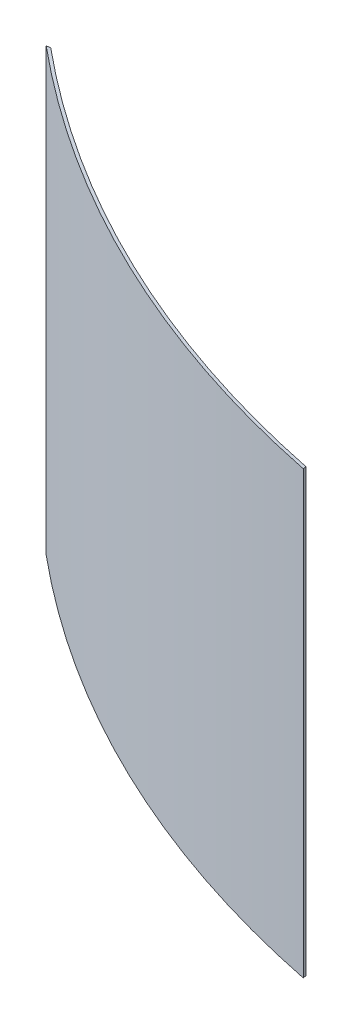
ISO-10303-21;
HEADER;
FILE_DESCRIPTION(('STEP AP214'),'2;1');
FILE_NAME('part.step','',(''),(''),'','','');
FILE_SCHEMA(('AUTOMOTIVE_DESIGN { 1 0 10303 214 1 1 1 1 }'));
ENDSEC;
DATA;
#1=APPLICATION_CONTEXT('core data for automotive mechanical design processes');
#2=APPLICATION_PROTOCOL_DEFINITION('international standard','automotive_design',2000,#1);
#3=PRODUCT_CONTEXT('',#1,'mechanical');
#4=PRODUCT('Part','Part','',(#3));
#5=PRODUCT_RELATED_PRODUCT_CATEGORY('part','',(#4));
#6=PRODUCT_DEFINITION_FORMATION('','',#4);
#7=PRODUCT_DEFINITION_CONTEXT('part definition',#1,'design');
#8=PRODUCT_DEFINITION('design','',#6,#7);
#9=PRODUCT_DEFINITION_SHAPE('','',#8);
#10=(LENGTH_UNIT() NAMED_UNIT(*) SI_UNIT(.MILLI.,.METRE.));
#11=(NAMED_UNIT(*) PLANE_ANGLE_UNIT() SI_UNIT($,.RADIAN.));
#12=(NAMED_UNIT(*) SI_UNIT($,.STERADIAN.) SOLID_ANGLE_UNIT());
#13=UNCERTAINTY_MEASURE_WITH_UNIT(LENGTH_MEASURE(1.E-05),#10,'distance_accuracy_value','');
#14=(GEOMETRIC_REPRESENTATION_CONTEXT(3) GLOBAL_UNCERTAINTY_ASSIGNED_CONTEXT((#13)) GLOBAL_UNIT_ASSIGNED_CONTEXT((#10,
#11,#12)) REPRESENTATION_CONTEXT('',''));
#15=CARTESIAN_POINT('',(0.,0.,0.));
#16=DIRECTION('',(0.,0.,1.));
#17=DIRECTION('',(1.,0.,0.));
#18=AXIS2_PLACEMENT_3D('',#15,#16,#17);
#19=CARTESIAN_POINT('',(0.,20.,0.));
#20=DIRECTION('',(0.,1.,0.));
#21=DIRECTION('',(0.,0.,1.));
#22=AXIS2_PLACEMENT_3D('',#19,#20,#21);
#23=PLANE('',#22);
#24=CARTESIAN_POINT('',(0.,20.,0.));
#25=DIRECTION('',(0.,1.,0.));
#26=DIRECTION('',(0.,0.,1.));
#27=AXIS2_PLACEMENT_3D('',#24,#25,#26);
#28=CIRCLE('',#27,51.0297553316353);
#29=CARTESIAN_POINT('',(-32.6396537617567,20.,39.2261256246293));
#30=VERTEX_POINT('',#29);
#31=CARTESIAN_POINT('',(-10.2118049668296,20.,49.9975496252166));
#32=VERTEX_POINT('',#31);
#33=EDGE_CURVE('E92',#30,#32,#28,.T.);
#34=ORIENTED_EDGE('',*,*,#33,.T.);
#35=CARTESIAN_POINT('',(-9.67297834039016,20.,44.564169780628));
#36=CARTESIAN_POINT('',(-11.5105091934088,20.,47.2284792425801));
#37=CARTESIAN_POINT('',(-7.54503339282564,20.,65.726006155042));
#38=CARTESIAN_POINT('',(26.7787556789923,20.,53.5279149457793));
#39=CARTESIAN_POINT('',(4.52810143568412,20.,45.3515646483001));
#40=CARTESIAN_POINT('',(-7.60625928539936,20.,41.5675511799864));
#41=CARTESIAN_POINT('',(-9.67297834039016,20.,44.564169780628));
#42=B_SPLINE_CURVE_WITH_KNOTS('',3,(#35,#36,#37,#38,#39,#40,#41),.UNSPECIFIED.,.T.,.F.,(4,1,1,1,
4),(0.,0.19861352696641,0.560569712652736,0.776614166730268,1.),.UNSPECIFIED.);
#43=CARTESIAN_POINT('',(-10.2417238109386,20.,49.85471564732));
#44=VERTEX_POINT('',#43);
#45=EDGE_CURVE('E74',#32,#44,#42,.F.);
#46=ORIENTED_EDGE('',*,*,#45,.T.);
#47=CARTESIAN_POINT('',(0.,20.,0.));
#48=DIRECTION('',(0.,1.,0.));
#49=DIRECTION('',(0.,0.,1.));
#50=AXIS2_PLACEMENT_3D('',#47,#48,#49);
#51=CIRCLE('',#50,50.8958306631759);
#52=CARTESIAN_POINT('',(-32.4747459103023,20.,39.1889838724607));
#53=VERTEX_POINT('',#52);
#54=EDGE_CURVE('E93',#53,#44,#51,.T.);
#55=ORIENTED_EDGE('',*,*,#54,.F.);
#56=CARTESIAN_POINT('',(-34.9047310326966,20.,39.5592146087704));
#57=CARTESIAN_POINT('',(-30.4584555686667,20.,39.2655092308571));
#58=CARTESIAN_POINT('',(-8.75106142960168,20.,27.588581360303));
#59=CARTESIAN_POINT('',(20.5453207769133,20.,14.8071367553495));
#60=CARTESIAN_POINT('',(86.6751682026254,20.,3.79780178426673));
#61=CARTESIAN_POINT('',(38.1721459014084,20.,-77.4697994385096));
#62=CARTESIAN_POINT('',(-39.9099809542056,20.,-55.8097985426568));
#63=CARTESIAN_POINT('',(-65.4681025130151,20.,-4.66044498882126));
#64=CARTESIAN_POINT('',(-50.7008514913476,20.,40.6026509784701));
#65=CARTESIAN_POINT('',(-34.9047310326966,20.,39.5592146087704));
#66=B_SPLINE_CURVE_WITH_KNOTS('',3,(#56,#57,#58,#59,#60,#61,#62,#63,#64,#65),.UNSPECIFIED.,.T.,
.F.,(4,1,1,1,1,1,1,4),(0.,0.0443076803980335,0.194241153002647,0.328566982733278,
0.483905615545977,0.75318939579471,0.842589722010524,1.),.UNSPECIFIED.);
#67=EDGE_CURVE('E55',#53,#30,#66,.F.);
#68=ORIENTED_EDGE('',*,*,#67,.T.);
#69=EDGE_LOOP('',(#34,#46,#55,#68));
#70=FACE_BOUND('',#69,.T.);
#71=ADVANCED_FACE('F33',(#70),#23,.T.);
#72=CARTESIAN_POINT('',(0.,0.,0.));
#73=DIRECTION('',(0.,1.,0.));
#74=DIRECTION('',(0.,0.,1.));
#75=AXIS2_PLACEMENT_3D('',#72,#73,#74);
#76=PLANE('',#75);
#77=CARTESIAN_POINT('',(-9.67297834039016,0.,44.564169780628));
#78=CARTESIAN_POINT('',(-11.5105091934088,0.,47.2284792425801));
#79=CARTESIAN_POINT('',(-7.54503339282564,0.,65.726006155042));
#80=CARTESIAN_POINT('',(26.7787556789923,0.,53.5279149457793));
#81=CARTESIAN_POINT('',(4.52810143568412,0.,45.3515646483001));
#82=CARTESIAN_POINT('',(-7.60625928539936,0.,41.5675511799864));
#83=CARTESIAN_POINT('',(-9.67297834039016,0.,44.564169780628));
#84=B_SPLINE_CURVE_WITH_KNOTS('',3,(#77,#78,#79,#80,#81,#82,#83),.UNSPECIFIED.,.T.,.F.,(4,1,1,1,
4),(0.,0.19861352696641,0.560569712652736,0.776614166730268,1.),.UNSPECIFIED.);
#85=CARTESIAN_POINT('',(-10.2417238109386,0.,49.85471564732));
#86=VERTEX_POINT('',#85);
#87=CARTESIAN_POINT('',(-10.2118049668296,0.,49.9975496252166));
#88=VERTEX_POINT('',#87);
#89=EDGE_CURVE('E48',#86,#88,#84,.T.);
#90=ORIENTED_EDGE('',*,*,#89,.T.);
#91=CARTESIAN_POINT('',(0.,0.,0.));
#92=DIRECTION('',(0.,1.,0.));
#93=DIRECTION('',(0.,0.,1.));
#94=AXIS2_PLACEMENT_3D('',#91,#92,#93);
#95=CIRCLE('',#94,51.0297553316353);
#96=CARTESIAN_POINT('',(-32.6396537617567,0.,39.2261256246293));
#97=VERTEX_POINT('',#96);
#98=EDGE_CURVE('E86',#97,#88,#95,.T.);
#99=ORIENTED_EDGE('',*,*,#98,.F.);
#100=CARTESIAN_POINT('',(-34.9047310326966,0.,39.5592146087704));
#101=CARTESIAN_POINT('',(-30.4584555686667,0.,39.2655092308571));
#102=CARTESIAN_POINT('',(-8.75106142960168,0.,27.588581360303));
#103=CARTESIAN_POINT('',(20.5453207769133,0.,14.8071367553495));
#104=CARTESIAN_POINT('',(86.6751682026254,0.,3.79780178426673));
#105=CARTESIAN_POINT('',(38.1721459014084,0.,-77.4697994385096));
#106=CARTESIAN_POINT('',(-39.9099809542056,0.,-55.8097985426568));
#107=CARTESIAN_POINT('',(-65.4681025130151,0.,-4.66044498882126));
#108=CARTESIAN_POINT('',(-50.7008514913476,0.,40.6026509784701));
#109=CARTESIAN_POINT('',(-34.9047310326966,0.,39.5592146087704));
#110=B_SPLINE_CURVE_WITH_KNOTS('',3,(#100,#101,#102,#103,#104,#105,#106,#107,#108,#109),
.UNSPECIFIED.,.T.,.F.,(4,1,1,1,1,1,1,4),(0.,0.0443076803980335,0.194241153002647,
0.328566982733278,0.483905615545977,0.75318939579471,0.842589722010524,1.),.UNSPECIFIED.);
#111=CARTESIAN_POINT('',(-32.4747459103021,0.,39.1889838724608));
#112=VERTEX_POINT('',#111);
#113=EDGE_CURVE('E79',#97,#112,#110,.T.);
#114=ORIENTED_EDGE('',*,*,#113,.T.);
#115=CARTESIAN_POINT('',(0.,0.,0.));
#116=DIRECTION('',(0.,1.,0.));
#117=DIRECTION('',(0.,0.,1.));
#118=AXIS2_PLACEMENT_3D('',#115,#116,#117);
#119=CIRCLE('',#118,50.8958306631759);
#120=EDGE_CURVE('E88',#112,#86,#119,.T.);
#121=ORIENTED_EDGE('',*,*,#120,.T.);
#122=EDGE_LOOP('',(#90,#99,#114,#121));
#123=FACE_BOUND('',#122,.T.);
#124=ADVANCED_FACE('F84',(#123),#76,.F.);
#125=CARTESIAN_POINT('',(0.,20.,0.));
#126=DIRECTION('',(0.,-1.,0.));
#127=DIRECTION('',(0.,0.,-1.));
#128=AXIS2_PLACEMENT_3D('',#125,#126,#127);
#129=CYLINDRICAL_SURFACE('',#128,51.0297553316353);
#130=DIRECTION('',(0.,-1.,0.));
#131=VECTOR('',#130,1.);
#132=CARTESIAN_POINT('',(-10.2118049668296,50.,49.9975496252166));
#133=LINE('',#132,#131);
#134=EDGE_CURVE('E71',#32,#88,#133,.T.);
#135=ORIENTED_EDGE('',*,*,#134,.F.);
#136=ORIENTED_EDGE('',*,*,#33,.F.);
#137=DIRECTION('',(0.,-1.,0.));
#138=VECTOR('',#137,1.);
#139=CARTESIAN_POINT('',(-32.6396537617571,50.,39.2261256246294));
#140=LINE('',#139,#138);
#141=EDGE_CURVE('E91',#97,#30,#140,.F.);
#142=ORIENTED_EDGE('',*,*,#141,.F.);
#143=ORIENTED_EDGE('',*,*,#98,.T.);
#144=EDGE_LOOP('',(#135,#136,#142,#143));
#145=FACE_BOUND('',#144,.T.);
#146=ADVANCED_FACE('F35',(#145),#129,.T.);
#147=CARTESIAN_POINT('',(0.,20.,0.));
#148=DIRECTION('',(0.,-1.,0.));
#149=DIRECTION('',(0.,0.,-1.));
#150=AXIS2_PLACEMENT_3D('',#147,#148,#149);
#151=CYLINDRICAL_SURFACE('',#150,50.8958306631759);
#152=ORIENTED_EDGE('',*,*,#54,.T.);
#153=DIRECTION('',(0.,-1.,0.));
#154=VECTOR('',#153,1.);
#155=CARTESIAN_POINT('',(-10.2417238109386,50.,49.85471564732));
#156=LINE('',#155,#154);
#157=EDGE_CURVE('E11',#44,#86,#156,.T.);
#158=ORIENTED_EDGE('',*,*,#157,.T.);
#159=ORIENTED_EDGE('',*,*,#120,.F.);
#160=DIRECTION('',(0.,-1.,0.));
#161=VECTOR('',#160,1.);
#162=CARTESIAN_POINT('',(-32.4747459103024,50.,39.1889838724609));
#163=LINE('',#162,#161);
#164=EDGE_CURVE('E41',#112,#53,#163,.F.);
#165=ORIENTED_EDGE('',*,*,#164,.T.);
#166=EDGE_LOOP('',(#152,#158,#159,#165));
#167=FACE_BOUND('',#166,.T.);
#168=ADVANCED_FACE('F101',(#167),#151,.F.);
#169=CARTESIAN_POINT('',(-34.9047310326966,50.,39.5592146087704));
#170=CARTESIAN_POINT('',(-30.4584555686667,50.,39.2655092308571));
#171=CARTESIAN_POINT('',(-8.75106142960168,50.,27.588581360303));
#172=CARTESIAN_POINT('',(20.5453207769133,50.,14.8071367553495));
#173=CARTESIAN_POINT('',(86.6751682026254,50.,3.79780178426673));
#174=CARTESIAN_POINT('',(38.1721459014084,50.,-77.4697994385096));
#175=CARTESIAN_POINT('',(-39.9099809542056,50.,-55.8097985426568));
#176=CARTESIAN_POINT('',(-65.4681025130151,50.,-4.66044498882126));
#177=CARTESIAN_POINT('',(-50.7008514913476,50.,40.6026509784701));
#178=CARTESIAN_POINT('',(-34.9047310326966,50.,39.5592146087704));
#179=B_SPLINE_CURVE_WITH_KNOTS('',3,(#169,#170,#171,#172,#173,#174,#175,#176,#177,#178),
.UNSPECIFIED.,.T.,.F.,(4,1,1,1,1,1,1,4),(0.,0.0443076803980335,0.194241153002647,
0.328566982733278,0.483905615545977,0.75318939579471,0.842589722010524,1.),.UNSPECIFIED.);
#180=DIRECTION('',(0.,-1.,0.));
#181=VECTOR('',#180,1.);
#182=SURFACE_OF_LINEAR_EXTRUSION('',#179,#181);
#183=ORIENTED_EDGE('',*,*,#141,.T.);
#184=ORIENTED_EDGE('',*,*,#67,.F.);
#185=ORIENTED_EDGE('',*,*,#164,.F.);
#186=ORIENTED_EDGE('',*,*,#113,.F.);
#187=EDGE_LOOP('',(#183,#184,#185,#186));
#188=FACE_BOUND('',#187,.T.);
#189=ADVANCED_FACE('F124',(#188),#182,.T.);
#190=CARTESIAN_POINT('',(-9.67297834039016,50.,44.564169780628));
#191=CARTESIAN_POINT('',(-11.5105091934088,50.,47.2284792425801));
#192=CARTESIAN_POINT('',(-7.54503339282564,50.,65.726006155042));
#193=CARTESIAN_POINT('',(26.7787556789923,50.,53.5279149457793));
#194=CARTESIAN_POINT('',(4.52810143568412,50.,45.3515646483001));
#195=CARTESIAN_POINT('',(-7.60625928539936,50.,41.5675511799864));
#196=CARTESIAN_POINT('',(-9.67297834039016,50.,44.564169780628));
#197=B_SPLINE_CURVE_WITH_KNOTS('',3,(#190,#191,#192,#193,#194,#195,#196),.UNSPECIFIED.,.T.,.F.,
(4,1,1,1,4),(0.,0.19861352696641,0.560569712652736,0.776614166730268,1.),.UNSPECIFIED.);
#198=DIRECTION('',(0.,-1.,0.));
#199=VECTOR('',#198,1.);
#200=SURFACE_OF_LINEAR_EXTRUSION('',#197,#199);
#201=ORIENTED_EDGE('',*,*,#134,.T.);
#202=ORIENTED_EDGE('',*,*,#89,.F.);
#203=ORIENTED_EDGE('',*,*,#157,.F.);
#204=ORIENTED_EDGE('',*,*,#45,.F.);
#205=EDGE_LOOP('',(#201,#202,#203,#204));
#206=FACE_BOUND('',#205,.T.);
#207=ADVANCED_FACE('F72',(#206),#200,.T.);
#208=CLOSED_SHELL('',(#71,#124,#146,#168,#189,#207));
#209=MANIFOLD_SOLID_BREP('B2',#208);
#210=ADVANCED_BREP_SHAPE_REPRESENTATION('',(#18,#209),#14);
#211=SHAPE_DEFINITION_REPRESENTATION(#9,#210);
ENDSEC;
END-ISO-10303-21;
